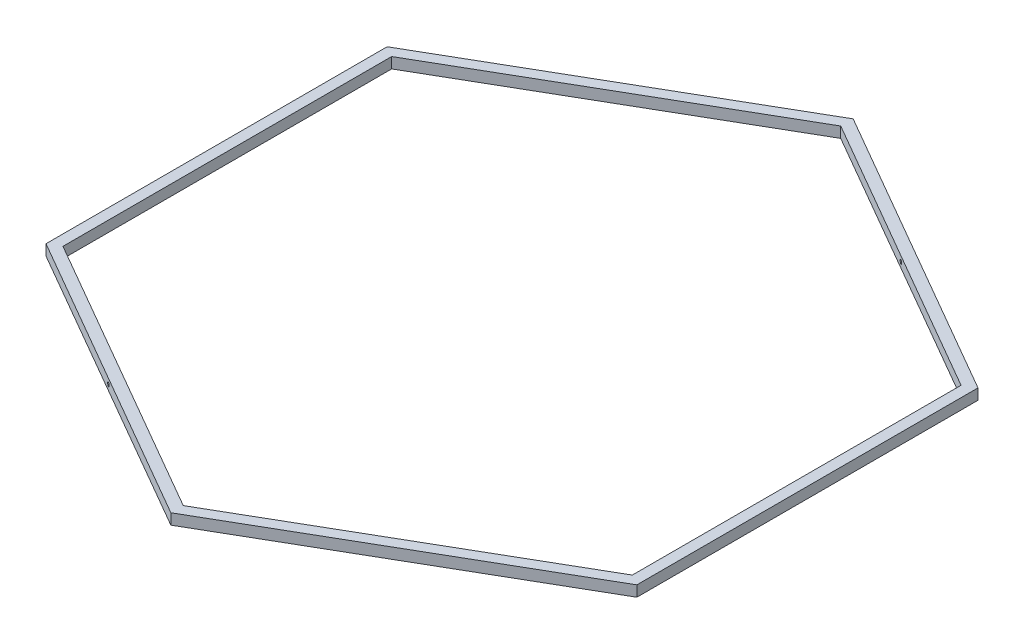
ISO-10303-21;
HEADER;
FILE_DESCRIPTION(('STEP AP214'),'2;1');
FILE_NAME('part.step','',(''),(''),'','','');
FILE_SCHEMA(('AUTOMOTIVE_DESIGN { 1 0 10303 214 1 1 1 1 }'));
ENDSEC;
DATA;
#1=APPLICATION_CONTEXT('core data for automotive mechanical design processes');
#2=APPLICATION_PROTOCOL_DEFINITION('international standard','automotive_design',2000,#1);
#3=PRODUCT_CONTEXT('',#1,'mechanical');
#4=PRODUCT('Part','Part','',(#3));
#5=PRODUCT_RELATED_PRODUCT_CATEGORY('part','',(#4));
#6=PRODUCT_DEFINITION_FORMATION('','',#4);
#7=PRODUCT_DEFINITION_CONTEXT('part definition',#1,'design');
#8=PRODUCT_DEFINITION('design','',#6,#7);
#9=PRODUCT_DEFINITION_SHAPE('','',#8);
#10=(LENGTH_UNIT() NAMED_UNIT(*) SI_UNIT(.MILLI.,.METRE.));
#11=(NAMED_UNIT(*) PLANE_ANGLE_UNIT() SI_UNIT($,.RADIAN.));
#12=(NAMED_UNIT(*) SI_UNIT($,.STERADIAN.) SOLID_ANGLE_UNIT());
#13=UNCERTAINTY_MEASURE_WITH_UNIT(LENGTH_MEASURE(1.E-05),#10,'distance_accuracy_value','');
#14=(GEOMETRIC_REPRESENTATION_CONTEXT(3) GLOBAL_UNCERTAINTY_ASSIGNED_CONTEXT((#13)) GLOBAL_UNIT_ASSIGNED_CONTEXT((#10,
#11,#12)) REPRESENTATION_CONTEXT('',''));
#15=CARTESIAN_POINT('',(0.,0.,0.));
#16=DIRECTION('',(0.,0.,1.));
#17=DIRECTION('',(1.,0.,0.));
#18=AXIS2_PLACEMENT_3D('',#15,#16,#17);
#19=CARTESIAN_POINT('',(0.,4.,0.));
#20=DIRECTION('',(0.,1.,0.));
#21=DIRECTION('',(0.,0.,1.));
#22=AXIS2_PLACEMENT_3D('',#19,#20,#21);
#23=PLANE('',#22);
#24=DIRECTION('',(-0.866025403784438,0.,-0.5));
#25=VECTOR('',#24,1.);
#26=CARTESIAN_POINT('',(110.,4.,-63.5085296108589));
#27=LINE('',#26,#25);
#28=CARTESIAN_POINT('',(110.,4.,-63.5085296108589));
#29=VERTEX_POINT('',#28);
#30=CARTESIAN_POINT('',(0.,4.,-127.017059221718));
#31=VERTEX_POINT('',#30);
#32=EDGE_CURVE('E205',#29,#31,#27,.T.);
#33=ORIENTED_EDGE('',*,*,#32,.T.);
#34=DIRECTION('',(-0.866025403784438,0.,0.5));
#35=VECTOR('',#34,1.);
#36=CARTESIAN_POINT('',(0.,4.,-127.017059221718));
#37=LINE('',#36,#35);
#38=CARTESIAN_POINT('',(-110.,4.,-63.5085296108588));
#39=VERTEX_POINT('',#38);
#40=EDGE_CURVE('E209',#31,#39,#37,.T.);
#41=ORIENTED_EDGE('',*,*,#40,.T.);
#42=DIRECTION('',(0.,0.,1.));
#43=VECTOR('',#42,1.);
#44=CARTESIAN_POINT('',(-110.,4.,-63.5085296108588));
#45=LINE('',#44,#43);
#46=CARTESIAN_POINT('',(-110.,4.,63.5085296108588));
#47=VERTEX_POINT('',#46);
#48=EDGE_CURVE('E213',#39,#47,#45,.T.);
#49=ORIENTED_EDGE('',*,*,#48,.T.);
#50=DIRECTION('',(0.866025403784439,0.,0.5));
#51=VECTOR('',#50,1.);
#52=CARTESIAN_POINT('',(-110.,4.,63.5085296108588));
#53=LINE('',#52,#51);
#54=CARTESIAN_POINT('',(0.,4.,127.017059221718));
#55=VERTEX_POINT('',#54);
#56=EDGE_CURVE('E216',#47,#55,#53,.T.);
#57=ORIENTED_EDGE('',*,*,#56,.T.);
#58=DIRECTION('',(0.866025403784438,0.,-0.5));
#59=VECTOR('',#58,1.);
#60=CARTESIAN_POINT('',(0.,4.,127.017059221718));
#61=LINE('',#60,#59);
#62=CARTESIAN_POINT('',(110.,4.,63.5085296108588));
#63=VERTEX_POINT('',#62);
#64=EDGE_CURVE('E219',#55,#63,#61,.T.);
#65=ORIENTED_EDGE('',*,*,#64,.T.);
#66=DIRECTION('',(0.,0.,-1.));
#67=VECTOR('',#66,1.);
#68=CARTESIAN_POINT('',(110.,4.,63.5085296108588));
#69=LINE('',#68,#67);
#70=EDGE_CURVE('E222',#63,#29,#69,.T.);
#71=ORIENTED_EDGE('',*,*,#70,.T.);
#72=EDGE_LOOP('',(#33,#41,#49,#57,#65,#71));
#73=FACE_BOUND('',#72,.T.);
#74=DIRECTION('',(-0.866025403784439,0.,-0.5));
#75=VECTOR('',#74,1.);
#76=CARTESIAN_POINT('',(106.,4.,-61.1991285341003));
#77=LINE('',#76,#75);
#78=CARTESIAN_POINT('',(106.,4.,-61.1991285341003));
#79=VERTEX_POINT('',#78);
#80=CARTESIAN_POINT('',(0.,4.,-122.398257068201));
#81=VERTEX_POINT('',#80);
#82=EDGE_CURVE('E143',#79,#81,#77,.T.);
#83=ORIENTED_EDGE('',*,*,#82,.F.);
#84=DIRECTION('',(0.,0.,-1.));
#85=VECTOR('',#84,1.);
#86=CARTESIAN_POINT('',(106.,4.,61.1991285341003));
#87=LINE('',#86,#85);
#88=CARTESIAN_POINT('',(106.,4.,61.1991285341003));
#89=VERTEX_POINT('',#88);
#90=EDGE_CURVE('E134',#89,#79,#87,.T.);
#91=ORIENTED_EDGE('',*,*,#90,.F.);
#92=DIRECTION('',(0.866025403784438,0.,-0.5));
#93=VECTOR('',#92,1.);
#94=CARTESIAN_POINT('',(0.,4.,122.398257068201));
#95=LINE('',#94,#93);
#96=CARTESIAN_POINT('',(0.,4.,122.398257068201));
#97=VERTEX_POINT('',#96);
#98=EDGE_CURVE('E170',#97,#89,#95,.T.);
#99=ORIENTED_EDGE('',*,*,#98,.F.);
#100=DIRECTION('',(0.866025403784439,0.,0.5));
#101=VECTOR('',#100,1.);
#102=CARTESIAN_POINT('',(-106.,4.,61.1991285341004));
#103=LINE('',#102,#101);
#104=CARTESIAN_POINT('',(-106.,4.,61.1991285341004));
#105=VERTEX_POINT('',#104);
#106=EDGE_CURVE('E167',#105,#97,#103,.T.);
#107=ORIENTED_EDGE('',*,*,#106,.F.);
#108=DIRECTION('',(0.,0.,1.));
#109=VECTOR('',#108,1.);
#110=CARTESIAN_POINT('',(-106.,4.,-61.1991285341003));
#111=LINE('',#110,#109);
#112=CARTESIAN_POINT('',(-106.,4.,-61.1991285341003));
#113=VERTEX_POINT('',#112);
#114=EDGE_CURVE('E161',#113,#105,#111,.T.);
#115=ORIENTED_EDGE('',*,*,#114,.F.);
#116=DIRECTION('',(-0.866025403784439,0.,0.5));
#117=VECTOR('',#116,1.);
#118=CARTESIAN_POINT('',(0.,4.,-122.398257068201));
#119=LINE('',#118,#117);
#120=EDGE_CURVE('E157',#81,#113,#119,.T.);
#121=ORIENTED_EDGE('',*,*,#120,.F.);
#122=EDGE_LOOP('',(#83,#91,#99,#107,#115,#121));
#123=FACE_BOUND('',#122,.T.);
#124=ADVANCED_FACE('F43',(#73,#123),#23,.T.);
#125=CARTESIAN_POINT('',(0.,0.,0.));
#126=DIRECTION('',(0.,1.,0.));
#127=DIRECTION('',(0.,0.,1.));
#128=AXIS2_PLACEMENT_3D('',#125,#126,#127);
#129=PLANE('',#128);
#130=DIRECTION('',(-0.866025403784438,0.,-0.5));
#131=VECTOR('',#130,1.);
#132=CARTESIAN_POINT('',(110.,0.,-63.5085296108589));
#133=LINE('',#132,#131);
#134=CARTESIAN_POINT('',(110.,0.,-63.5085296108589));
#135=VERTEX_POINT('',#134);
#136=CARTESIAN_POINT('',(0.,0.,-127.017059221718));
#137=VERTEX_POINT('',#136);
#138=EDGE_CURVE('E152',#135,#137,#133,.T.);
#139=ORIENTED_EDGE('',*,*,#138,.F.);
#140=DIRECTION('',(0.,0.,-1.));
#141=VECTOR('',#140,1.);
#142=CARTESIAN_POINT('',(110.,0.,63.5085296108588));
#143=LINE('',#142,#141);
#144=CARTESIAN_POINT('',(110.,0.,63.5085296108588));
#145=VERTEX_POINT('',#144);
#146=EDGE_CURVE('E210',#145,#135,#143,.T.);
#147=ORIENTED_EDGE('',*,*,#146,.F.);
#148=DIRECTION('',(0.866025403784438,0.,-0.5));
#149=VECTOR('',#148,1.);
#150=CARTESIAN_POINT('',(0.,0.,127.017059221718));
#151=LINE('',#150,#149);
#152=CARTESIAN_POINT('',(0.,0.,127.017059221718));
#153=VERTEX_POINT('',#152);
#154=EDGE_CURVE('E238',#153,#145,#151,.T.);
#155=ORIENTED_EDGE('',*,*,#154,.F.);
#156=DIRECTION('',(0.866025403784439,0.,0.5));
#157=VECTOR('',#156,1.);
#158=CARTESIAN_POINT('',(-110.,0.,63.5085296108588));
#159=LINE('',#158,#157);
#160=CARTESIAN_POINT('',(-110.,0.,63.5085296108588));
#161=VERTEX_POINT('',#160);
#162=EDGE_CURVE('E235',#161,#153,#159,.T.);
#163=ORIENTED_EDGE('',*,*,#162,.F.);
#164=DIRECTION('',(0.,0.,1.));
#165=VECTOR('',#164,1.);
#166=CARTESIAN_POINT('',(-110.,0.,-63.5085296108588));
#167=LINE('',#166,#165);
#168=CARTESIAN_POINT('',(-110.,0.,-63.5085296108588));
#169=VERTEX_POINT('',#168);
#170=EDGE_CURVE('E232',#169,#161,#167,.T.);
#171=ORIENTED_EDGE('',*,*,#170,.F.);
#172=DIRECTION('',(-0.866025403784438,0.,0.5));
#173=VECTOR('',#172,1.);
#174=CARTESIAN_POINT('',(0.,0.,-127.017059221718));
#175=LINE('',#174,#173);
#176=EDGE_CURVE('E229',#137,#169,#175,.T.);
#177=ORIENTED_EDGE('',*,*,#176,.F.);
#178=EDGE_LOOP('',(#139,#147,#155,#163,#171,#177));
#179=FACE_BOUND('',#178,.T.);
#180=DIRECTION('',(0.,0.,-1.));
#181=VECTOR('',#180,1.);
#182=CARTESIAN_POINT('',(106.,0.,61.1991285341003));
#183=LINE('',#182,#181);
#184=CARTESIAN_POINT('',(106.,0.,61.1991285341003));
#185=VERTEX_POINT('',#184);
#186=CARTESIAN_POINT('',(106.,0.,-61.1991285341003));
#187=VERTEX_POINT('',#186);
#188=EDGE_CURVE('E68',#185,#187,#183,.T.);
#189=ORIENTED_EDGE('',*,*,#188,.T.);
#190=DIRECTION('',(-0.866025403784439,0.,-0.5));
#191=VECTOR('',#190,1.);
#192=CARTESIAN_POINT('',(106.,0.,-61.1991285341003));
#193=LINE('',#192,#191);
#194=CARTESIAN_POINT('',(0.,0.,-122.398257068201));
#195=VERTEX_POINT('',#194);
#196=EDGE_CURVE('E150',#187,#195,#193,.T.);
#197=ORIENTED_EDGE('',*,*,#196,.T.);
#198=DIRECTION('',(-0.866025403784439,0.,0.5));
#199=VECTOR('',#198,1.);
#200=CARTESIAN_POINT('',(0.,0.,-122.398257068201));
#201=LINE('',#200,#199);
#202=CARTESIAN_POINT('',(-106.,0.,-61.1991285341003));
#203=VERTEX_POINT('',#202);
#204=EDGE_CURVE('E178',#195,#203,#201,.T.);
#205=ORIENTED_EDGE('',*,*,#204,.T.);
#206=DIRECTION('',(0.,0.,1.));
#207=VECTOR('',#206,1.);
#208=CARTESIAN_POINT('',(-106.,0.,-61.1991285341003));
#209=LINE('',#208,#207);
#210=CARTESIAN_POINT('',(-106.,0.,61.1991285341004));
#211=VERTEX_POINT('',#210);
#212=EDGE_CURVE('E182',#203,#211,#209,.T.);
#213=ORIENTED_EDGE('',*,*,#212,.T.);
#214=DIRECTION('',(0.866025403784439,0.,0.5));
#215=VECTOR('',#214,1.);
#216=CARTESIAN_POINT('',(-106.,0.,61.1991285341004));
#217=LINE('',#216,#215);
#218=CARTESIAN_POINT('',(0.,0.,122.398257068201));
#219=VERTEX_POINT('',#218);
#220=EDGE_CURVE('E186',#211,#219,#217,.T.);
#221=ORIENTED_EDGE('',*,*,#220,.T.);
#222=DIRECTION('',(0.866025403784438,0.,-0.5));
#223=VECTOR('',#222,1.);
#224=CARTESIAN_POINT('',(0.,0.,122.398257068201));
#225=LINE('',#224,#223);
#226=EDGE_CURVE('E144',#219,#185,#225,.T.);
#227=ORIENTED_EDGE('',*,*,#226,.T.);
#228=EDGE_LOOP('',(#189,#197,#205,#213,#221,#227));
#229=FACE_BOUND('',#228,.T.);
#230=ADVANCED_FACE('F270',(#179,#229),#129,.F.);
#231=CARTESIAN_POINT('',(110.,4.,-63.5085296108589));
#232=DIRECTION('',(-0.5,0.,0.866025403784439));
#233=DIRECTION('',(0.866025403784438,0.,0.5));
#234=AXIS2_PLACEMENT_3D('',#231,#232,#233);
#235=PLANE('',#234);
#236=CARTESIAN_POINT('',(55.,2.,-95.2627944162883));
#237=DIRECTION('',(-0.5,0.,0.866025403784439));
#238=DIRECTION('',(0.866025403784438,0.,0.5));
#239=AXIS2_PLACEMENT_3D('',#236,#237,#238);
#240=CIRCLE('',#239,0.749999999999996);
#241=CARTESIAN_POINT('',(55.6495190528383,2.,-94.8877944162883));
#242=VERTEX_POINT('',#241);
#243=EDGE_CURVE('E175',#242,#242,#240,.T.);
#244=ORIENTED_EDGE('',*,*,#243,.T.);
#245=EDGE_LOOP('',(#244));
#246=FACE_BOUND('',#245,.T.);
#247=ORIENTED_EDGE('',*,*,#138,.T.);
#248=DIRECTION('',(0.,-1.,0.));
#249=VECTOR('',#248,1.);
#250=CARTESIAN_POINT('',(0.,4.,-127.017059221718));
#251=LINE('',#250,#249);
#252=EDGE_CURVE('E11',#31,#137,#251,.T.);
#253=ORIENTED_EDGE('',*,*,#252,.F.);
#254=ORIENTED_EDGE('',*,*,#32,.F.);
#255=DIRECTION('',(0.,-1.,0.));
#256=VECTOR('',#255,1.);
#257=CARTESIAN_POINT('',(110.,4.,-63.5085296108589));
#258=LINE('',#257,#256);
#259=EDGE_CURVE('E225',#29,#135,#258,.T.);
#260=ORIENTED_EDGE('',*,*,#259,.T.);
#261=EDGE_LOOP('',(#247,#253,#254,#260));
#262=FACE_BOUND('',#261,.T.);
#263=ADVANCED_FACE('F45',(#246,#262),#235,.F.);
#264=CARTESIAN_POINT('',(0.,4.,-127.017059221718));
#265=DIRECTION('',(0.5,0.,0.866025403784439));
#266=DIRECTION('',(0.866025403784438,0.,-0.5));
#267=AXIS2_PLACEMENT_3D('',#264,#265,#266);
#268=PLANE('',#267);
#269=ORIENTED_EDGE('',*,*,#176,.T.);
#270=DIRECTION('',(0.,-1.,0.));
#271=VECTOR('',#270,1.);
#272=CARTESIAN_POINT('',(-110.,4.,-63.5085296108588));
#273=LINE('',#272,#271);
#274=EDGE_CURVE('E53',#39,#169,#273,.T.);
#275=ORIENTED_EDGE('',*,*,#274,.F.);
#276=ORIENTED_EDGE('',*,*,#40,.F.);
#277=ORIENTED_EDGE('',*,*,#252,.T.);
#278=EDGE_LOOP('',(#269,#275,#276,#277));
#279=FACE_BOUND('',#278,.T.);
#280=ADVANCED_FACE('F287',(#279),#268,.F.);
#281=CARTESIAN_POINT('',(-110.,4.,-63.5085296108588));
#282=DIRECTION('',(1.,0.,0.));
#283=DIRECTION('',(0.,0.,-1.));
#284=AXIS2_PLACEMENT_3D('',#281,#282,#283);
#285=PLANE('',#284);
#286=ORIENTED_EDGE('',*,*,#170,.T.);
#287=DIRECTION('',(0.,-1.,0.));
#288=VECTOR('',#287,1.);
#289=CARTESIAN_POINT('',(-110.,4.,63.5085296108588));
#290=LINE('',#289,#288);
#291=EDGE_CURVE('E254',#47,#161,#290,.T.);
#292=ORIENTED_EDGE('',*,*,#291,.F.);
#293=ORIENTED_EDGE('',*,*,#48,.F.);
#294=ORIENTED_EDGE('',*,*,#274,.T.);
#295=EDGE_LOOP('',(#286,#292,#293,#294));
#296=FACE_BOUND('',#295,.T.);
#297=ADVANCED_FACE('F264',(#296),#285,.F.);
#298=CARTESIAN_POINT('',(-110.,4.,63.5085296108588));
#299=DIRECTION('',(0.5,0.,-0.866025403784439));
#300=DIRECTION('',(-0.866025403784439,0.,-0.5));
#301=AXIS2_PLACEMENT_3D('',#298,#299,#300);
#302=PLANE('',#301);
#303=CARTESIAN_POINT('',(-55.,2.,95.2627944162883));
#304=DIRECTION('',(-0.5,0.,0.866025403784439));
#305=DIRECTION('',(0.866025403784439,0.,0.5));
#306=AXIS2_PLACEMENT_3D('',#303,#304,#305);
#307=CIRCLE('',#306,0.749999999999996);
#308=CARTESIAN_POINT('',(-54.3504809471617,2.,95.6377944162883));
#309=VERTEX_POINT('',#308);
#310=EDGE_CURVE('E337',#309,#309,#307,.T.);
#311=ORIENTED_EDGE('',*,*,#310,.F.);
#312=EDGE_LOOP('',(#311));
#313=FACE_BOUND('',#312,.T.);
#314=ORIENTED_EDGE('',*,*,#162,.T.);
#315=DIRECTION('',(0.,-1.,0.));
#316=VECTOR('',#315,1.);
#317=CARTESIAN_POINT('',(0.,4.,127.017059221718));
#318=LINE('',#317,#316);
#319=EDGE_CURVE('E250',#55,#153,#318,.T.);
#320=ORIENTED_EDGE('',*,*,#319,.F.);
#321=ORIENTED_EDGE('',*,*,#56,.F.);
#322=ORIENTED_EDGE('',*,*,#291,.T.);
#323=EDGE_LOOP('',(#314,#320,#321,#322));
#324=FACE_BOUND('',#323,.T.);
#325=ADVANCED_FACE('F276',(#313,#324),#302,.F.);
#326=CARTESIAN_POINT('',(0.,4.,127.017059221718));
#327=DIRECTION('',(-0.5,0.,-0.866025403784438));
#328=DIRECTION('',(-0.866025403784439,0.,0.5));
#329=AXIS2_PLACEMENT_3D('',#326,#327,#328);
#330=PLANE('',#329);
#331=ORIENTED_EDGE('',*,*,#154,.T.);
#332=DIRECTION('',(0.,-1.,0.));
#333=VECTOR('',#332,1.);
#334=CARTESIAN_POINT('',(110.,4.,63.5085296108588));
#335=LINE('',#334,#333);
#336=EDGE_CURVE('E246',#63,#145,#335,.T.);
#337=ORIENTED_EDGE('',*,*,#336,.F.);
#338=ORIENTED_EDGE('',*,*,#64,.F.);
#339=ORIENTED_EDGE('',*,*,#319,.T.);
#340=EDGE_LOOP('',(#331,#337,#338,#339));
#341=FACE_BOUND('',#340,.T.);
#342=ADVANCED_FACE('F280',(#341),#330,.F.);
#343=CARTESIAN_POINT('',(110.,4.,63.5085296108588));
#344=DIRECTION('',(-1.,0.,0.));
#345=DIRECTION('',(0.,0.,1.));
#346=AXIS2_PLACEMENT_3D('',#343,#344,#345);
#347=PLANE('',#346);
#348=ORIENTED_EDGE('',*,*,#146,.T.);
#349=ORIENTED_EDGE('',*,*,#259,.F.);
#350=ORIENTED_EDGE('',*,*,#70,.F.);
#351=ORIENTED_EDGE('',*,*,#336,.T.);
#352=EDGE_LOOP('',(#348,#349,#350,#351));
#353=FACE_BOUND('',#352,.T.);
#354=ADVANCED_FACE('F290',(#353),#347,.F.);
#355=CARTESIAN_POINT('',(106.,4.,61.1991285341003));
#356=DIRECTION('',(-1.,0.,0.));
#357=DIRECTION('',(0.,0.,1.));
#358=AXIS2_PLACEMENT_3D('',#355,#356,#357);
#359=PLANE('',#358);
#360=ORIENTED_EDGE('',*,*,#188,.F.);
#361=DIRECTION('',(0.,-1.,0.));
#362=VECTOR('',#361,1.);
#363=CARTESIAN_POINT('',(106.,4.,61.1991285341003));
#364=LINE('',#363,#362);
#365=EDGE_CURVE('E138',#89,#185,#364,.T.);
#366=ORIENTED_EDGE('',*,*,#365,.F.);
#367=ORIENTED_EDGE('',*,*,#90,.T.);
#368=DIRECTION('',(0.,-1.,0.));
#369=VECTOR('',#368,1.);
#370=CARTESIAN_POINT('',(106.,4.,-61.1991285341003));
#371=LINE('',#370,#369);
#372=EDGE_CURVE('E137',#79,#187,#371,.T.);
#373=ORIENTED_EDGE('',*,*,#372,.T.);
#374=EDGE_LOOP('',(#360,#366,#367,#373));
#375=FACE_BOUND('',#374,.T.);
#376=ADVANCED_FACE('F136',(#375),#359,.T.);
#377=CARTESIAN_POINT('',(106.,4.,-61.1991285341003));
#378=DIRECTION('',(-0.5,0.,0.866025403784439));
#379=DIRECTION('',(0.866025403784439,0.,0.5));
#380=AXIS2_PLACEMENT_3D('',#377,#378,#379);
#381=PLANE('',#380);
#382=CARTESIAN_POINT('',(53.,2.,-91.7986928011505));
#383=DIRECTION('',(-0.5,0.,0.866025403784439));
#384=DIRECTION('',(0.866025403784439,0.,0.5));
#385=AXIS2_PLACEMENT_3D('',#382,#383,#384);
#386=CIRCLE('',#385,0.749999999999996);
#387=CARTESIAN_POINT('',(53.6495190528383,2.,-91.4236928011505));
#388=VERTEX_POINT('',#387);
#389=EDGE_CURVE('E342',#388,#388,#386,.T.);
#390=ORIENTED_EDGE('',*,*,#389,.F.);
#391=EDGE_LOOP('',(#390));
#392=FACE_BOUND('',#391,.T.);
#393=ORIENTED_EDGE('',*,*,#196,.F.);
#394=ORIENTED_EDGE('',*,*,#372,.F.);
#395=ORIENTED_EDGE('',*,*,#82,.T.);
#396=DIRECTION('',(0.,-1.,0.));
#397=VECTOR('',#396,1.);
#398=CARTESIAN_POINT('',(0.,4.,-122.398257068201));
#399=LINE('',#398,#397);
#400=EDGE_CURVE('E153',#81,#195,#399,.T.);
#401=ORIENTED_EDGE('',*,*,#400,.T.);
#402=EDGE_LOOP('',(#393,#394,#395,#401));
#403=FACE_BOUND('',#402,.T.);
#404=ADVANCED_FACE('F147',(#392,#403),#381,.T.);
#405=CARTESIAN_POINT('',(0.,4.,-122.398257068201));
#406=DIRECTION('',(0.5,0.,0.866025403784439));
#407=DIRECTION('',(0.866025403784439,0.,-0.5));
#408=AXIS2_PLACEMENT_3D('',#405,#406,#407);
#409=PLANE('',#408);
#410=ORIENTED_EDGE('',*,*,#204,.F.);
#411=ORIENTED_EDGE('',*,*,#400,.F.);
#412=ORIENTED_EDGE('',*,*,#120,.T.);
#413=DIRECTION('',(0.,-1.,0.));
#414=VECTOR('',#413,1.);
#415=CARTESIAN_POINT('',(-106.,4.,-61.1991285341003));
#416=LINE('',#415,#414);
#417=EDGE_CURVE('E200',#113,#203,#416,.T.);
#418=ORIENTED_EDGE('',*,*,#417,.T.);
#419=EDGE_LOOP('',(#410,#411,#412,#418));
#420=FACE_BOUND('',#419,.T.);
#421=ADVANCED_FACE('F308',(#420),#409,.T.);
#422=CARTESIAN_POINT('',(-106.,4.,-61.1991285341003));
#423=DIRECTION('',(1.,0.,0.));
#424=DIRECTION('',(0.,0.,-1.));
#425=AXIS2_PLACEMENT_3D('',#422,#423,#424);
#426=PLANE('',#425);
#427=ORIENTED_EDGE('',*,*,#212,.F.);
#428=ORIENTED_EDGE('',*,*,#417,.F.);
#429=ORIENTED_EDGE('',*,*,#114,.T.);
#430=DIRECTION('',(0.,-1.,0.));
#431=VECTOR('',#430,1.);
#432=CARTESIAN_POINT('',(-106.,4.,61.1991285341004));
#433=LINE('',#432,#431);
#434=EDGE_CURVE('E197',#105,#211,#433,.T.);
#435=ORIENTED_EDGE('',*,*,#434,.T.);
#436=EDGE_LOOP('',(#427,#428,#429,#435));
#437=FACE_BOUND('',#436,.T.);
#438=ADVANCED_FACE('F312',(#437),#426,.T.);
#439=CARTESIAN_POINT('',(-106.,4.,61.1991285341004));
#440=DIRECTION('',(0.5,0.,-0.866025403784439));
#441=DIRECTION('',(-0.866025403784439,0.,-0.5));
#442=AXIS2_PLACEMENT_3D('',#439,#440,#441);
#443=PLANE('',#442);
#444=CARTESIAN_POINT('',(-53.,2.,91.7986928011506));
#445=DIRECTION('',(0.5,0.,-0.866025403784439));
#446=DIRECTION('',(-0.866025403784439,0.,-0.5));
#447=AXIS2_PLACEMENT_3D('',#444,#445,#446);
#448=CIRCLE('',#447,0.749999999999996);
#449=CARTESIAN_POINT('',(-53.6495190528384,2.,91.4236928011506));
#450=VERTEX_POINT('',#449);
#451=EDGE_CURVE('E47',#450,#450,#448,.T.);
#452=ORIENTED_EDGE('',*,*,#451,.F.);
#453=EDGE_LOOP('',(#452));
#454=FACE_BOUND('',#453,.T.);
#455=ORIENTED_EDGE('',*,*,#220,.F.);
#456=ORIENTED_EDGE('',*,*,#434,.F.);
#457=ORIENTED_EDGE('',*,*,#106,.T.);
#458=DIRECTION('',(0.,-1.,0.));
#459=VECTOR('',#458,1.);
#460=CARTESIAN_POINT('',(0.,4.,122.398257068201));
#461=LINE('',#460,#459);
#462=EDGE_CURVE('E60',#97,#219,#461,.T.);
#463=ORIENTED_EDGE('',*,*,#462,.T.);
#464=EDGE_LOOP('',(#455,#456,#457,#463));
#465=FACE_BOUND('',#464,.T.);
#466=ADVANCED_FACE('F316',(#454,#465),#443,.T.);
#467=CARTESIAN_POINT('',(0.,4.,122.398257068201));
#468=DIRECTION('',(-0.5,0.,-0.866025403784439));
#469=DIRECTION('',(-0.866025403784438,0.,0.5));
#470=AXIS2_PLACEMENT_3D('',#467,#468,#469);
#471=PLANE('',#470);
#472=ORIENTED_EDGE('',*,*,#226,.F.);
#473=ORIENTED_EDGE('',*,*,#462,.F.);
#474=ORIENTED_EDGE('',*,*,#98,.T.);
#475=ORIENTED_EDGE('',*,*,#365,.T.);
#476=EDGE_LOOP('',(#472,#473,#474,#475));
#477=FACE_BOUND('',#476,.T.);
#478=ADVANCED_FACE('F320',(#477),#471,.T.);
#479=CARTESIAN_POINT('',(82.5,2.,-142.894191624432));
#480=DIRECTION('',(-0.5,0.,0.866025403784439));
#481=DIRECTION('',(0.866025403784439,0.,0.5));
#482=AXIS2_PLACEMENT_3D('',#479,#480,#481);
#483=CYLINDRICAL_SURFACE('',#482,0.749999999999996);
#484=ORIENTED_EDGE('',*,*,#451,.T.);
#485=EDGE_LOOP('',(#484));
#486=FACE_BOUND('',#485,.T.);
#487=ORIENTED_EDGE('',*,*,#310,.T.);
#488=EDGE_LOOP('',(#487));
#489=FACE_BOUND('',#488,.T.);
#490=ADVANCED_FACE('F324',(#486,#489),#483,.F.);
#491=ORIENTED_EDGE('',*,*,#389,.T.);
#492=EDGE_LOOP('',(#491));
#493=FACE_BOUND('',#492,.T.);
#494=ORIENTED_EDGE('',*,*,#243,.F.);
#495=EDGE_LOOP('',(#494));
#496=FACE_BOUND('',#495,.T.);
#497=ADVANCED_FACE('F326',(#493,#496),#483,.F.);
#498=CLOSED_SHELL('',(#124,#230,#263,#280,#297,#325,#342,#354,#376,#404,#421,#438,#466,#478,
#490,#497));
#499=MANIFOLD_SOLID_BREP('B2',#498);
#500=ADVANCED_BREP_SHAPE_REPRESENTATION('',(#18,#499),#14);
#501=SHAPE_DEFINITION_REPRESENTATION(#9,#500);
ENDSEC;
END-ISO-10303-21;
